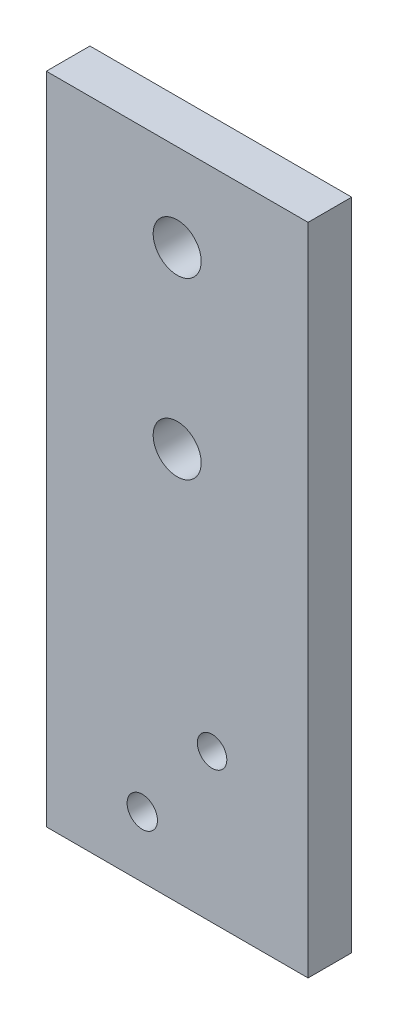
ISO-10303-21;
HEADER;
FILE_DESCRIPTION(('STEP AP214'),'2;1');
FILE_NAME('part.step','',(''),(''),'','','');
FILE_SCHEMA(('AUTOMOTIVE_DESIGN { 1 0 10303 214 1 1 1 1 }'));
ENDSEC;
DATA;
#1=APPLICATION_CONTEXT('core data for automotive mechanical design processes');
#2=APPLICATION_PROTOCOL_DEFINITION('international standard','automotive_design',2000,#1);
#3=PRODUCT_CONTEXT('',#1,'mechanical');
#4=PRODUCT('Part','Part','',(#3));
#5=PRODUCT_RELATED_PRODUCT_CATEGORY('part','',(#4));
#6=PRODUCT_DEFINITION_FORMATION('','',#4);
#7=PRODUCT_DEFINITION_CONTEXT('part definition',#1,'design');
#8=PRODUCT_DEFINITION('design','',#6,#7);
#9=PRODUCT_DEFINITION_SHAPE('','',#8);
#10=(LENGTH_UNIT() NAMED_UNIT(*) SI_UNIT(.MILLI.,.METRE.));
#11=(NAMED_UNIT(*) PLANE_ANGLE_UNIT() SI_UNIT($,.RADIAN.));
#12=(NAMED_UNIT(*) SI_UNIT($,.STERADIAN.) SOLID_ANGLE_UNIT());
#13=UNCERTAINTY_MEASURE_WITH_UNIT(LENGTH_MEASURE(1.E-05),#10,'distance_accuracy_value','');
#14=(GEOMETRIC_REPRESENTATION_CONTEXT(3) GLOBAL_UNCERTAINTY_ASSIGNED_CONTEXT((#13)) GLOBAL_UNIT_ASSIGNED_CONTEXT((#10,
#11,#12)) REPRESENTATION_CONTEXT('',''));
#15=CARTESIAN_POINT('',(0.,0.,0.));
#16=DIRECTION('',(0.,0.,1.));
#17=DIRECTION('',(1.,0.,0.));
#18=AXIS2_PLACEMENT_3D('',#15,#16,#17);
#19=CARTESIAN_POINT('',(0.,0.,5.));
#20=DIRECTION('',(0.,0.,1.));
#21=DIRECTION('',(1.,0.,0.));
#22=AXIS2_PLACEMENT_3D('',#19,#20,#21);
#23=PLANE('',#22);
#24=CARTESIAN_POINT('',(-19.,7.,5.));
#25=DIRECTION('',(0.,0.,1.));
#26=DIRECTION('',(1.,0.,0.));
#27=AXIS2_PLACEMENT_3D('',#24,#25,#26);
#28=CIRCLE('',#27,1.74130251075517);
#29=CARTESIAN_POINT('',(-17.2586974892448,7.,5.));
#30=VERTEX_POINT('',#29);
#31=EDGE_CURVE('E142',#30,#30,#28,.T.);
#32=ORIENTED_EDGE('',*,*,#31,.F.);
#33=EDGE_LOOP('',(#32));
#34=FACE_BOUND('',#33,.T.);
#35=CARTESIAN_POINT('',(-15.,65.,5.));
#36=DIRECTION('',(0.,0.,1.));
#37=DIRECTION('',(1.,0.,0.));
#38=AXIS2_PLACEMENT_3D('',#35,#36,#37);
#39=CIRCLE('',#38,2.75);
#40=CARTESIAN_POINT('',(-12.25,65.,5.));
#41=VERTEX_POINT('',#40);
#42=EDGE_CURVE('E112',#41,#41,#39,.T.);
#43=ORIENTED_EDGE('',*,*,#42,.F.);
#44=EDGE_LOOP('',(#43));
#45=FACE_BOUND('',#44,.T.);
#46=DIRECTION('',(0.,1.,0.));
#47=VECTOR('',#46,1.);
#48=CARTESIAN_POINT('',(0.,0.,5.));
#49=LINE('',#48,#47);
#50=CARTESIAN_POINT('',(0.,0.,5.));
#51=VERTEX_POINT('',#50);
#52=CARTESIAN_POINT('',(0.,75.,5.));
#53=VERTEX_POINT('',#52);
#54=EDGE_CURVE('E92',#51,#53,#49,.T.);
#55=ORIENTED_EDGE('',*,*,#54,.T.);
#56=DIRECTION('',(-1.,0.,0.));
#57=VECTOR('',#56,1.);
#58=CARTESIAN_POINT('',(0.,75.,5.));
#59=LINE('',#58,#57);
#60=CARTESIAN_POINT('',(-30.,75.,5.));
#61=VERTEX_POINT('',#60);
#62=EDGE_CURVE('E87',#53,#61,#59,.T.);
#63=ORIENTED_EDGE('',*,*,#62,.T.);
#64=DIRECTION('',(0.,-1.,0.));
#65=VECTOR('',#64,1.);
#66=CARTESIAN_POINT('',(-30.,0.,5.));
#67=LINE('',#66,#65);
#68=CARTESIAN_POINT('',(-30.,0.,5.));
#69=VERTEX_POINT('',#68);
#70=EDGE_CURVE('E90',#61,#69,#67,.T.);
#71=ORIENTED_EDGE('',*,*,#70,.T.);
#72=DIRECTION('',(1.,0.,0.));
#73=VECTOR('',#72,1.);
#74=CARTESIAN_POINT('',(0.,0.,5.));
#75=LINE('',#74,#73);
#76=EDGE_CURVE('E57',#69,#51,#75,.T.);
#77=ORIENTED_EDGE('',*,*,#76,.T.);
#78=EDGE_LOOP('',(#55,#63,#71,#77));
#79=FACE_BOUND('',#78,.T.);
#80=CARTESIAN_POINT('',(-15.,45.,5.));
#81=DIRECTION('',(0.,0.,1.));
#82=DIRECTION('',(1.,0.,0.));
#83=AXIS2_PLACEMENT_3D('',#80,#81,#82);
#84=CIRCLE('',#83,2.75);
#85=CARTESIAN_POINT('',(-12.25,45.,5.));
#86=VERTEX_POINT('',#85);
#87=EDGE_CURVE('E134',#86,#86,#84,.T.);
#88=ORIENTED_EDGE('',*,*,#87,.F.);
#89=EDGE_LOOP('',(#88));
#90=FACE_BOUND('',#89,.T.);
#91=CARTESIAN_POINT('',(-11.,17.,5.));
#92=DIRECTION('',(0.,0.,1.));
#93=DIRECTION('',(1.,0.,0.));
#94=AXIS2_PLACEMENT_3D('',#91,#92,#93);
#95=CIRCLE('',#94,1.68931157129335);
#96=CARTESIAN_POINT('',(-9.31068842870666,17.,5.));
#97=VERTEX_POINT('',#96);
#98=EDGE_CURVE('E150',#97,#97,#95,.T.);
#99=ORIENTED_EDGE('',*,*,#98,.F.);
#100=EDGE_LOOP('',(#99));
#101=FACE_BOUND('',#100,.T.);
#102=ADVANCED_FACE('F39',(#34,#45,#79,#90,#101),#23,.T.);
#103=CARTESIAN_POINT('',(0.,0.,0.));
#104=DIRECTION('',(0.,0.,1.));
#105=DIRECTION('',(1.,0.,0.));
#106=AXIS2_PLACEMENT_3D('',#103,#104,#105);
#107=PLANE('',#106);
#108=DIRECTION('',(0.,1.,0.));
#109=VECTOR('',#108,1.);
#110=CARTESIAN_POINT('',(0.,0.,0.));
#111=LINE('',#110,#109);
#112=CARTESIAN_POINT('',(0.,0.,0.));
#113=VERTEX_POINT('',#112);
#114=CARTESIAN_POINT('',(0.,75.,0.));
#115=VERTEX_POINT('',#114);
#116=EDGE_CURVE('E108',#113,#115,#111,.T.);
#117=ORIENTED_EDGE('',*,*,#116,.F.);
#118=DIRECTION('',(1.,0.,0.));
#119=VECTOR('',#118,1.);
#120=CARTESIAN_POINT('',(0.,0.,0.));
#121=LINE('',#120,#119);
#122=CARTESIAN_POINT('',(-30.,0.,0.));
#123=VERTEX_POINT('',#122);
#124=EDGE_CURVE('E80',#123,#113,#121,.T.);
#125=ORIENTED_EDGE('',*,*,#124,.F.);
#126=DIRECTION('',(0.,-1.,0.));
#127=VECTOR('',#126,1.);
#128=CARTESIAN_POINT('',(-30.,0.,0.));
#129=LINE('',#128,#127);
#130=CARTESIAN_POINT('',(-30.,75.,0.));
#131=VERTEX_POINT('',#130);
#132=EDGE_CURVE('E74',#131,#123,#129,.T.);
#133=ORIENTED_EDGE('',*,*,#132,.F.);
#134=DIRECTION('',(-1.,0.,0.));
#135=VECTOR('',#134,1.);
#136=CARTESIAN_POINT('',(0.,75.,0.));
#137=LINE('',#136,#135);
#138=EDGE_CURVE('E97',#115,#131,#137,.T.);
#139=ORIENTED_EDGE('',*,*,#138,.F.);
#140=EDGE_LOOP('',(#117,#125,#133,#139));
#141=FACE_BOUND('',#140,.T.);
#142=CARTESIAN_POINT('',(-15.,65.,0.));
#143=DIRECTION('',(0.,0.,1.));
#144=DIRECTION('',(1.,0.,0.));
#145=AXIS2_PLACEMENT_3D('',#142,#143,#144);
#146=CIRCLE('',#145,2.75);
#147=CARTESIAN_POINT('',(-12.25,65.,0.));
#148=VERTEX_POINT('',#147);
#149=EDGE_CURVE('E130',#148,#148,#146,.T.);
#150=ORIENTED_EDGE('',*,*,#149,.T.);
#151=EDGE_LOOP('',(#150));
#152=FACE_BOUND('',#151,.T.);
#153=CARTESIAN_POINT('',(-15.,45.,0.));
#154=DIRECTION('',(0.,0.,1.));
#155=DIRECTION('',(1.,0.,0.));
#156=AXIS2_PLACEMENT_3D('',#153,#154,#155);
#157=CIRCLE('',#156,2.75);
#158=CARTESIAN_POINT('',(-12.25,45.,0.));
#159=VERTEX_POINT('',#158);
#160=EDGE_CURVE('E138',#159,#159,#157,.T.);
#161=ORIENTED_EDGE('',*,*,#160,.T.);
#162=EDGE_LOOP('',(#161));
#163=FACE_BOUND('',#162,.T.);
#164=CARTESIAN_POINT('',(-19.,7.,0.));
#165=DIRECTION('',(0.,0.,1.));
#166=DIRECTION('',(1.,0.,0.));
#167=AXIS2_PLACEMENT_3D('',#164,#165,#166);
#168=CIRCLE('',#167,1.74130251075517);
#169=CARTESIAN_POINT('',(-17.2586974892448,7.,0.));
#170=VERTEX_POINT('',#169);
#171=EDGE_CURVE('E146',#170,#170,#168,.T.);
#172=ORIENTED_EDGE('',*,*,#171,.T.);
#173=EDGE_LOOP('',(#172));
#174=FACE_BOUND('',#173,.T.);
#175=CARTESIAN_POINT('',(-11.,17.,0.));
#176=DIRECTION('',(0.,0.,1.));
#177=DIRECTION('',(1.,0.,0.));
#178=AXIS2_PLACEMENT_3D('',#175,#176,#177);
#179=CIRCLE('',#178,1.68931157129335);
#180=CARTESIAN_POINT('',(-9.31068842870666,17.,0.));
#181=VERTEX_POINT('',#180);
#182=EDGE_CURVE('E154',#181,#181,#179,.T.);
#183=ORIENTED_EDGE('',*,*,#182,.T.);
#184=EDGE_LOOP('',(#183));
#185=FACE_BOUND('',#184,.T.);
#186=ADVANCED_FACE('F125',(#141,#152,#163,#174,#185),#107,.F.);
#187=CARTESIAN_POINT('',(0.,0.,5.));
#188=DIRECTION('',(-1.,0.,0.));
#189=DIRECTION('',(0.,0.,1.));
#190=AXIS2_PLACEMENT_3D('',#187,#188,#189);
#191=PLANE('',#190);
#192=ORIENTED_EDGE('',*,*,#116,.T.);
#193=DIRECTION('',(0.,0.,-1.));
#194=VECTOR('',#193,1.);
#195=CARTESIAN_POINT('',(0.,75.,5.));
#196=LINE('',#195,#194);
#197=EDGE_CURVE('E11',#53,#115,#196,.T.);
#198=ORIENTED_EDGE('',*,*,#197,.F.);
#199=ORIENTED_EDGE('',*,*,#54,.F.);
#200=DIRECTION('',(0.,0.,-1.));
#201=VECTOR('',#200,1.);
#202=CARTESIAN_POINT('',(0.,0.,5.));
#203=LINE('',#202,#201);
#204=EDGE_CURVE('E104',#51,#113,#203,.T.);
#205=ORIENTED_EDGE('',*,*,#204,.T.);
#206=EDGE_LOOP('',(#192,#198,#199,#205));
#207=FACE_BOUND('',#206,.T.);
#208=ADVANCED_FACE('F41',(#207),#191,.F.);
#209=CARTESIAN_POINT('',(0.,75.,5.));
#210=DIRECTION('',(0.,-1.,0.));
#211=DIRECTION('',(0.,0.,-1.));
#212=AXIS2_PLACEMENT_3D('',#209,#210,#211);
#213=PLANE('',#212);
#214=ORIENTED_EDGE('',*,*,#138,.T.);
#215=DIRECTION('',(0.,0.,-1.));
#216=VECTOR('',#215,1.);
#217=CARTESIAN_POINT('',(-30.,75.,5.));
#218=LINE('',#217,#216);
#219=EDGE_CURVE('E49',#61,#131,#218,.T.);
#220=ORIENTED_EDGE('',*,*,#219,.F.);
#221=ORIENTED_EDGE('',*,*,#62,.F.);
#222=ORIENTED_EDGE('',*,*,#197,.T.);
#223=EDGE_LOOP('',(#214,#220,#221,#222));
#224=FACE_BOUND('',#223,.T.);
#225=ADVANCED_FACE('F96',(#224),#213,.F.);
#226=CARTESIAN_POINT('',(-30.,0.,5.));
#227=DIRECTION('',(1.,0.,0.));
#228=DIRECTION('',(0.,1.,0.));
#229=AXIS2_PLACEMENT_3D('',#226,#227,#228);
#230=PLANE('',#229);
#231=ORIENTED_EDGE('',*,*,#132,.T.);
#232=DIRECTION('',(0.,0.,-1.));
#233=VECTOR('',#232,1.);
#234=CARTESIAN_POINT('',(-30.,0.,5.));
#235=LINE('',#234,#233);
#236=EDGE_CURVE('E99',#69,#123,#235,.T.);
#237=ORIENTED_EDGE('',*,*,#236,.F.);
#238=ORIENTED_EDGE('',*,*,#70,.F.);
#239=ORIENTED_EDGE('',*,*,#219,.T.);
#240=EDGE_LOOP('',(#231,#237,#238,#239));
#241=FACE_BOUND('',#240,.T.);
#242=ADVANCED_FACE('F100',(#241),#230,.F.);
#243=CARTESIAN_POINT('',(0.,0.,5.));
#244=DIRECTION('',(0.,1.,0.));
#245=DIRECTION('',(-1.,0.,0.));
#246=AXIS2_PLACEMENT_3D('',#243,#244,#245);
#247=PLANE('',#246);
#248=ORIENTED_EDGE('',*,*,#124,.T.);
#249=ORIENTED_EDGE('',*,*,#204,.F.);
#250=ORIENTED_EDGE('',*,*,#76,.F.);
#251=ORIENTED_EDGE('',*,*,#236,.T.);
#252=EDGE_LOOP('',(#248,#249,#250,#251));
#253=FACE_BOUND('',#252,.T.);
#254=ADVANCED_FACE('F122',(#253),#247,.F.);
#255=CARTESIAN_POINT('',(-15.,65.,5.));
#256=DIRECTION('',(0.,0.,-1.));
#257=DIRECTION('',(-1.,0.,0.));
#258=AXIS2_PLACEMENT_3D('',#255,#256,#257);
#259=CYLINDRICAL_SURFACE('',#258,2.75);
#260=ORIENTED_EDGE('',*,*,#42,.T.);
#261=EDGE_LOOP('',(#260));
#262=FACE_BOUND('',#261,.T.);
#263=ORIENTED_EDGE('',*,*,#149,.F.);
#264=EDGE_LOOP('',(#263));
#265=FACE_BOUND('',#264,.T.);
#266=ADVANCED_FACE('F175',(#262,#265),#259,.F.);
#267=CARTESIAN_POINT('',(-15.,45.,5.));
#268=DIRECTION('',(0.,0.,-1.));
#269=DIRECTION('',(-1.,0.,0.));
#270=AXIS2_PLACEMENT_3D('',#267,#268,#269);
#271=CYLINDRICAL_SURFACE('',#270,2.75);
#272=ORIENTED_EDGE('',*,*,#87,.T.);
#273=EDGE_LOOP('',(#272));
#274=FACE_BOUND('',#273,.T.);
#275=ORIENTED_EDGE('',*,*,#160,.F.);
#276=EDGE_LOOP('',(#275));
#277=FACE_BOUND('',#276,.T.);
#278=ADVANCED_FACE('F221',(#274,#277),#271,.F.);
#279=CARTESIAN_POINT('',(-19.,7.,5.));
#280=DIRECTION('',(0.,0.,-1.));
#281=DIRECTION('',(-1.,0.,0.));
#282=AXIS2_PLACEMENT_3D('',#279,#280,#281);
#283=CYLINDRICAL_SURFACE('',#282,1.74130251075517);
#284=ORIENTED_EDGE('',*,*,#31,.T.);
#285=EDGE_LOOP('',(#284));
#286=FACE_BOUND('',#285,.T.);
#287=ORIENTED_EDGE('',*,*,#171,.F.);
#288=EDGE_LOOP('',(#287));
#289=FACE_BOUND('',#288,.T.);
#290=ADVANCED_FACE('F229',(#286,#289),#283,.F.);
#291=CARTESIAN_POINT('',(-11.,17.,5.));
#292=DIRECTION('',(0.,0.,-1.));
#293=DIRECTION('',(-1.,0.,0.));
#294=AXIS2_PLACEMENT_3D('',#291,#292,#293);
#295=CYLINDRICAL_SURFACE('',#294,1.68931157129335);
#296=ORIENTED_EDGE('',*,*,#98,.T.);
#297=EDGE_LOOP('',(#296));
#298=FACE_BOUND('',#297,.T.);
#299=ORIENTED_EDGE('',*,*,#182,.F.);
#300=EDGE_LOOP('',(#299));
#301=FACE_BOUND('',#300,.T.);
#302=ADVANCED_FACE('F162',(#298,#301),#295,.F.);
#303=CLOSED_SHELL('',(#102,#186,#208,#225,#242,#254,#266,#278,#290,#302));
#304=MANIFOLD_SOLID_BREP('B2',#303);
#305=ADVANCED_BREP_SHAPE_REPRESENTATION('',(#18,#304),#14);
#306=SHAPE_DEFINITION_REPRESENTATION(#9,#305);
ENDSEC;
END-ISO-10303-21;
